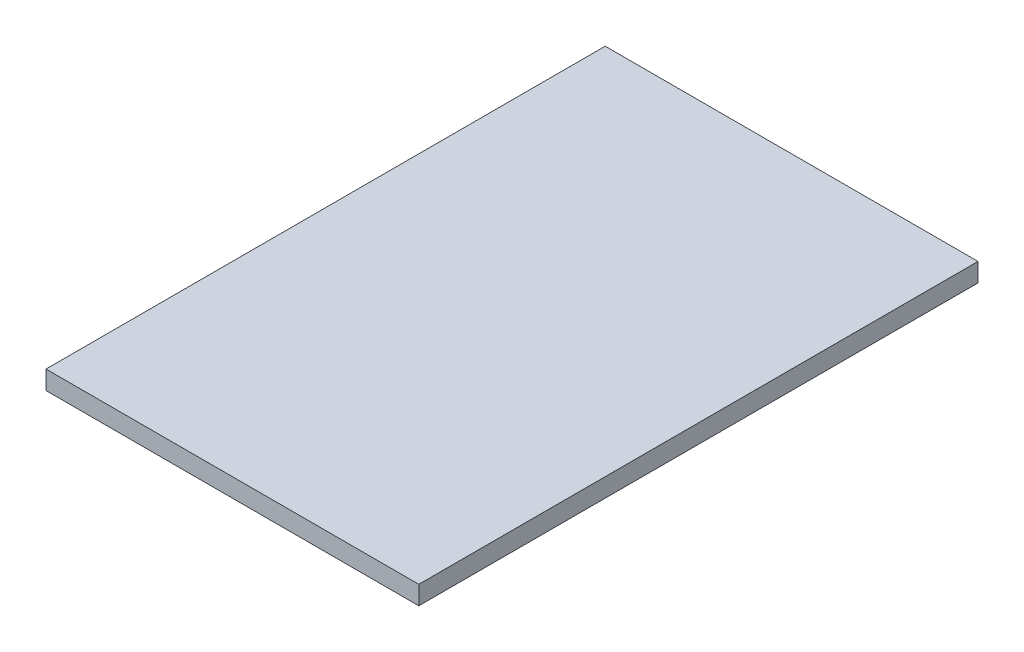
ISO-10303-21;
HEADER;
FILE_DESCRIPTION(('STEP AP214'),'2;1');
FILE_NAME('part.step','',(''),(''),'','','');
FILE_SCHEMA(('AUTOMOTIVE_DESIGN { 1 0 10303 214 1 1 1 1 }'));
ENDSEC;
DATA;
#1=APPLICATION_CONTEXT('core data for automotive mechanical design processes');
#2=APPLICATION_PROTOCOL_DEFINITION('international standard','automotive_design',2000,#1);
#3=PRODUCT_CONTEXT('',#1,'mechanical');
#4=PRODUCT('Part','Part','',(#3));
#5=PRODUCT_RELATED_PRODUCT_CATEGORY('part','',(#4));
#6=PRODUCT_DEFINITION_FORMATION('','',#4);
#7=PRODUCT_DEFINITION_CONTEXT('part definition',#1,'design');
#8=PRODUCT_DEFINITION('design','',#6,#7);
#9=PRODUCT_DEFINITION_SHAPE('','',#8);
#10=(LENGTH_UNIT() NAMED_UNIT(*) SI_UNIT(.MILLI.,.METRE.));
#11=(NAMED_UNIT(*) PLANE_ANGLE_UNIT() SI_UNIT($,.RADIAN.));
#12=(NAMED_UNIT(*) SI_UNIT($,.STERADIAN.) SOLID_ANGLE_UNIT());
#13=UNCERTAINTY_MEASURE_WITH_UNIT(LENGTH_MEASURE(1.E-05),#10,'distance_accuracy_value','');
#14=(GEOMETRIC_REPRESENTATION_CONTEXT(3) GLOBAL_UNCERTAINTY_ASSIGNED_CONTEXT((#13)) GLOBAL_UNIT_ASSIGNED_CONTEXT((#10,
#11,#12)) REPRESENTATION_CONTEXT('',''));
#15=CARTESIAN_POINT('',(0.,0.,0.));
#16=DIRECTION('',(0.,0.,1.));
#17=DIRECTION('',(1.,0.,0.));
#18=AXIS2_PLACEMENT_3D('',#15,#16,#17);
#19=CARTESIAN_POINT('',(-10.,1.,-15.));
#20=DIRECTION('',(0.,0.,1.));
#21=DIRECTION('',(1.,0.,0.));
#22=AXIS2_PLACEMENT_3D('',#19,#20,#21);
#23=PLANE('',#22);
#24=DIRECTION('',(-1.,0.,0.));
#25=VECTOR('',#24,1.);
#26=CARTESIAN_POINT('',(-10.,0.,-15.));
#27=LINE('',#26,#25);
#28=CARTESIAN_POINT('',(10.,0.,-15.));
#29=VERTEX_POINT('',#28);
#30=CARTESIAN_POINT('',(-10.,0.,-15.));
#31=VERTEX_POINT('',#30);
#32=EDGE_CURVE('E98',#29,#31,#27,.T.);
#33=ORIENTED_EDGE('',*,*,#32,.T.);
#34=DIRECTION('',(0.,-1.,0.));
#35=VECTOR('',#34,1.);
#36=CARTESIAN_POINT('',(-10.,1.,-15.));
#37=LINE('',#36,#35);
#38=CARTESIAN_POINT('',(-10.,1.,-15.));
#39=VERTEX_POINT('',#38);
#40=EDGE_CURVE('E11',#39,#31,#37,.T.);
#41=ORIENTED_EDGE('',*,*,#40,.F.);
#42=DIRECTION('',(-1.,0.,0.));
#43=VECTOR('',#42,1.);
#44=CARTESIAN_POINT('',(-10.,1.,-15.));
#45=LINE('',#44,#43);
#46=CARTESIAN_POINT('',(10.,1.,-15.));
#47=VERTEX_POINT('',#46);
#48=EDGE_CURVE('E86',#47,#39,#45,.T.);
#49=ORIENTED_EDGE('',*,*,#48,.F.);
#50=DIRECTION('',(0.,-1.,0.));
#51=VECTOR('',#50,1.);
#52=CARTESIAN_POINT('',(10.,1.,-15.));
#53=LINE('',#52,#51);
#54=EDGE_CURVE('E94',#47,#29,#53,.T.);
#55=ORIENTED_EDGE('',*,*,#54,.T.);
#56=EDGE_LOOP('',(#33,#41,#49,#55));
#57=FACE_BOUND('',#56,.T.);
#58=ADVANCED_FACE('F35',(#57),#23,.F.);
#59=CARTESIAN_POINT('',(-10.,1.,-15.));
#60=DIRECTION('',(1.,0.,0.));
#61=DIRECTION('',(0.,0.,-1.));
#62=AXIS2_PLACEMENT_3D('',#59,#60,#61);
#63=PLANE('',#62);
#64=DIRECTION('',(0.,0.,1.));
#65=VECTOR('',#64,1.);
#66=CARTESIAN_POINT('',(-10.,0.,-15.));
#67=LINE('',#66,#65);
#68=CARTESIAN_POINT('',(-9.99999999999961,0.,15.));
#69=VERTEX_POINT('',#68);
#70=EDGE_CURVE('E90',#31,#69,#67,.T.);
#71=ORIENTED_EDGE('',*,*,#70,.T.);
#72=DIRECTION('',(0.,-1.,0.));
#73=VECTOR('',#72,1.);
#74=CARTESIAN_POINT('',(-9.99999999999961,1.,15.));
#75=LINE('',#74,#73);
#76=CARTESIAN_POINT('',(-9.99999999999961,1.,15.));
#77=VERTEX_POINT('',#76);
#78=EDGE_CURVE('E43',#77,#69,#75,.T.);
#79=ORIENTED_EDGE('',*,*,#78,.F.);
#80=DIRECTION('',(0.,0.,1.));
#81=VECTOR('',#80,1.);
#82=CARTESIAN_POINT('',(-10.,1.,-15.));
#83=LINE('',#82,#81);
#84=EDGE_CURVE('E81',#39,#77,#83,.T.);
#85=ORIENTED_EDGE('',*,*,#84,.F.);
#86=ORIENTED_EDGE('',*,*,#40,.T.);
#87=EDGE_LOOP('',(#71,#79,#85,#86));
#88=FACE_BOUND('',#87,.T.);
#89=ADVANCED_FACE('F89',(#88),#63,.F.);
#90=CARTESIAN_POINT('',(-9.99999999999961,1.,15.));
#91=DIRECTION('',(0.,0.,-1.));
#92=DIRECTION('',(-1.,0.,0.));
#93=AXIS2_PLACEMENT_3D('',#90,#91,#92);
#94=PLANE('',#93);
#95=DIRECTION('',(1.,0.,0.));
#96=VECTOR('',#95,1.);
#97=CARTESIAN_POINT('',(-9.99999999999961,0.,15.));
#98=LINE('',#97,#96);
#99=CARTESIAN_POINT('',(10.,0.,15.));
#100=VERTEX_POINT('',#99);
#101=EDGE_CURVE('E68',#69,#100,#98,.T.);
#102=ORIENTED_EDGE('',*,*,#101,.T.);
#103=DIRECTION('',(0.,-1.,0.));
#104=VECTOR('',#103,1.);
#105=CARTESIAN_POINT('',(10.,1.,15.));
#106=LINE('',#105,#104);
#107=CARTESIAN_POINT('',(10.,1.,15.));
#108=VERTEX_POINT('',#107);
#109=EDGE_CURVE('E91',#108,#100,#106,.T.);
#110=ORIENTED_EDGE('',*,*,#109,.F.);
#111=DIRECTION('',(1.,0.,0.));
#112=VECTOR('',#111,1.);
#113=CARTESIAN_POINT('',(-9.99999999999961,1.,15.));
#114=LINE('',#113,#112);
#115=EDGE_CURVE('E84',#77,#108,#114,.T.);
#116=ORIENTED_EDGE('',*,*,#115,.F.);
#117=ORIENTED_EDGE('',*,*,#78,.T.);
#118=EDGE_LOOP('',(#102,#110,#116,#117));
#119=FACE_BOUND('',#118,.T.);
#120=ADVANCED_FACE('F92',(#119),#94,.F.);
#121=CARTESIAN_POINT('',(10.,1.,-15.));
#122=DIRECTION('',(-1.,0.,0.));
#123=DIRECTION('',(0.,0.,1.));
#124=AXIS2_PLACEMENT_3D('',#121,#122,#123);
#125=PLANE('',#124);
#126=DIRECTION('',(0.,0.,-1.));
#127=VECTOR('',#126,1.);
#128=CARTESIAN_POINT('',(10.,0.,-15.));
#129=LINE('',#128,#127);
#130=EDGE_CURVE('E74',#100,#29,#129,.T.);
#131=ORIENTED_EDGE('',*,*,#130,.T.);
#132=ORIENTED_EDGE('',*,*,#54,.F.);
#133=DIRECTION('',(0.,0.,-1.));
#134=VECTOR('',#133,1.);
#135=CARTESIAN_POINT('',(10.,1.,-15.));
#136=LINE('',#135,#134);
#137=EDGE_CURVE('E51',#108,#47,#136,.T.);
#138=ORIENTED_EDGE('',*,*,#137,.F.);
#139=ORIENTED_EDGE('',*,*,#109,.T.);
#140=EDGE_LOOP('',(#131,#132,#138,#139));
#141=FACE_BOUND('',#140,.T.);
#142=ADVANCED_FACE('F105',(#141),#125,.F.);
#143=CARTESIAN_POINT('',(0.,1.,0.));
#144=DIRECTION('',(0.,-1.,0.));
#145=DIRECTION('',(0.,0.,-1.));
#146=AXIS2_PLACEMENT_3D('',#143,#144,#145);
#147=PLANE('',#146);
#148=ORIENTED_EDGE('',*,*,#48,.T.);
#149=ORIENTED_EDGE('',*,*,#84,.T.);
#150=ORIENTED_EDGE('',*,*,#115,.T.);
#151=ORIENTED_EDGE('',*,*,#137,.T.);
#152=EDGE_LOOP('',(#148,#149,#150,#151));
#153=FACE_BOUND('',#152,.T.);
#154=ADVANCED_FACE('F82',(#153),#147,.F.);
#155=CARTESIAN_POINT('',(0.,0.,0.));
#156=DIRECTION('',(0.,-1.,0.));
#157=DIRECTION('',(0.,0.,-1.));
#158=AXIS2_PLACEMENT_3D('',#155,#156,#157);
#159=PLANE('',#158);
#160=ORIENTED_EDGE('',*,*,#32,.F.);
#161=ORIENTED_EDGE('',*,*,#130,.F.);
#162=ORIENTED_EDGE('',*,*,#101,.F.);
#163=ORIENTED_EDGE('',*,*,#70,.F.);
#164=EDGE_LOOP('',(#160,#161,#162,#163));
#165=FACE_BOUND('',#164,.T.);
#166=ADVANCED_FACE('F108',(#165),#159,.T.);
#167=CLOSED_SHELL('',(#58,#89,#120,#142,#154,#166));
#168=MANIFOLD_SOLID_BREP('B2',#167);
#169=ADVANCED_BREP_SHAPE_REPRESENTATION('',(#18,#168),#14);
#170=SHAPE_DEFINITION_REPRESENTATION(#9,#169);
ENDSEC;
END-ISO-10303-21;
